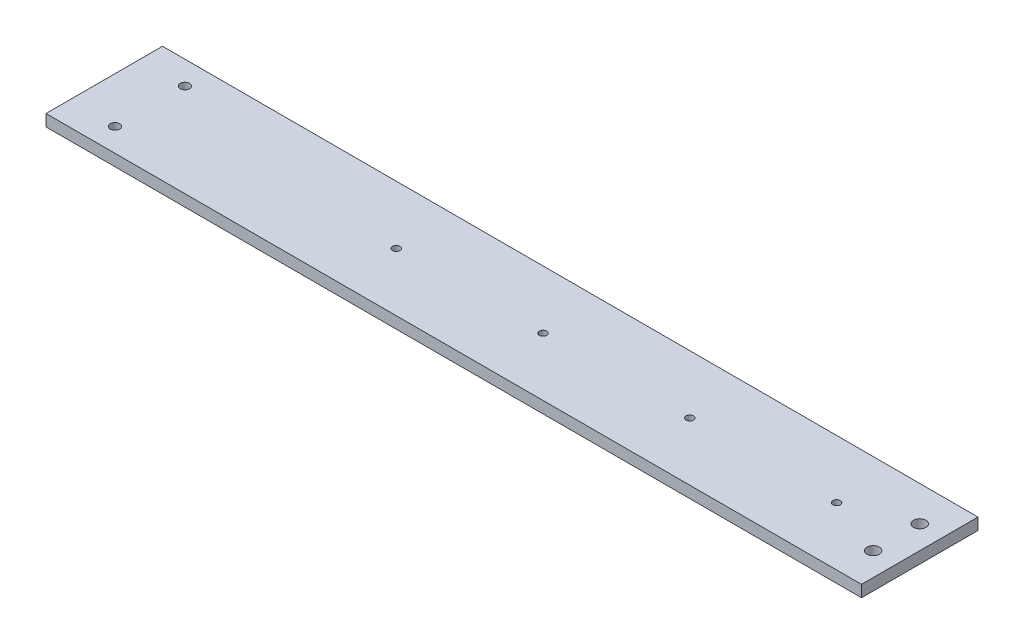
ISO-10303-21;
HEADER;
FILE_DESCRIPTION(('STEP AP214'),'2;1');
FILE_NAME('part.step','',(''),(''),'','','');
FILE_SCHEMA(('AUTOMOTIVE_DESIGN { 1 0 10303 214 1 1 1 1 }'));
ENDSEC;
DATA;
#1=APPLICATION_CONTEXT('core data for automotive mechanical design processes');
#2=APPLICATION_PROTOCOL_DEFINITION('international standard','automotive_design',2000,#1);
#3=PRODUCT_CONTEXT('',#1,'mechanical');
#4=PRODUCT('Part','Part','',(#3));
#5=PRODUCT_RELATED_PRODUCT_CATEGORY('part','',(#4));
#6=PRODUCT_DEFINITION_FORMATION('','',#4);
#7=PRODUCT_DEFINITION_CONTEXT('part definition',#1,'design');
#8=PRODUCT_DEFINITION('design','',#6,#7);
#9=PRODUCT_DEFINITION_SHAPE('','',#8);
#10=(LENGTH_UNIT() NAMED_UNIT(*) SI_UNIT(.MILLI.,.METRE.));
#11=(NAMED_UNIT(*) PLANE_ANGLE_UNIT() SI_UNIT($,.RADIAN.));
#12=(NAMED_UNIT(*) SI_UNIT($,.STERADIAN.) SOLID_ANGLE_UNIT());
#13=UNCERTAINTY_MEASURE_WITH_UNIT(LENGTH_MEASURE(1.E-05),#10,'distance_accuracy_value','');
#14=(GEOMETRIC_REPRESENTATION_CONTEXT(3) GLOBAL_UNCERTAINTY_ASSIGNED_CONTEXT((#13)) GLOBAL_UNIT_ASSIGNED_CONTEXT((#10,
#11,#12)) REPRESENTATION_CONTEXT('',''));
#15=CARTESIAN_POINT('',(0.,0.,0.));
#16=DIRECTION('',(0.,0.,1.));
#17=DIRECTION('',(1.,0.,0.));
#18=AXIS2_PLACEMENT_3D('',#15,#16,#17);
#19=CARTESIAN_POINT('',(50.8,6.35,25.4));
#20=DIRECTION('',(0.,0.,-1.));
#21=DIRECTION('',(-1.,0.,0.));
#22=AXIS2_PLACEMENT_3D('',#19,#20,#21);
#23=PLANE('',#22);
#24=DIRECTION('',(1.,0.,0.));
#25=VECTOR('',#24,1.);
#26=CARTESIAN_POINT('',(50.8,0.,25.4));
#27=LINE('',#26,#25);
#28=CARTESIAN_POINT('',(0.,0.,25.4));
#29=VERTEX_POINT('',#28);
#30=CARTESIAN_POINT('',(444.5,0.,25.4));
#31=VERTEX_POINT('',#30);
#32=EDGE_CURVE('E86',#29,#31,#27,.T.);
#33=ORIENTED_EDGE('',*,*,#32,.T.);
#34=DIRECTION('',(0.,-1.,0.));
#35=VECTOR('',#34,1.);
#36=CARTESIAN_POINT('',(444.5,6.35,25.4));
#37=LINE('',#36,#35);
#38=CARTESIAN_POINT('',(444.5,6.35,25.4));
#39=VERTEX_POINT('',#38);
#40=EDGE_CURVE('E42',#39,#31,#37,.T.);
#41=ORIENTED_EDGE('',*,*,#40,.F.);
#42=DIRECTION('',(1.,0.,0.));
#43=VECTOR('',#42,1.);
#44=CARTESIAN_POINT('',(0.,6.35,25.4));
#45=LINE('',#44,#43);
#46=CARTESIAN_POINT('',(0.,6.35,25.4));
#47=VERTEX_POINT('',#46);
#48=EDGE_CURVE('E77',#47,#39,#45,.T.);
#49=ORIENTED_EDGE('',*,*,#48,.F.);
#50=DIRECTION('',(0.,-1.,0.));
#51=VECTOR('',#50,1.);
#52=CARTESIAN_POINT('',(0.,6.35,25.4));
#53=LINE('',#52,#51);
#54=EDGE_CURVE('E11',#47,#29,#53,.T.);
#55=ORIENTED_EDGE('',*,*,#54,.T.);
#56=EDGE_LOOP('',(#33,#41,#49,#55));
#57=FACE_BOUND('',#56,.T.);
#58=ADVANCED_FACE('F34',(#57),#23,.F.);
#59=CARTESIAN_POINT('',(444.5,6.35,25.4));
#60=DIRECTION('',(-1.,0.,0.));
#61=DIRECTION('',(0.,0.,1.));
#62=AXIS2_PLACEMENT_3D('',#59,#60,#61);
#63=PLANE('',#62);
#64=DIRECTION('',(0.,0.,-1.));
#65=VECTOR('',#64,1.);
#66=CARTESIAN_POINT('',(444.5,0.,25.4));
#67=LINE('',#66,#65);
#68=CARTESIAN_POINT('',(444.5,0.,-38.1));
#69=VERTEX_POINT('',#68);
#70=EDGE_CURVE('E97',#31,#69,#67,.T.);
#71=ORIENTED_EDGE('',*,*,#70,.T.);
#72=DIRECTION('',(0.,-1.,0.));
#73=VECTOR('',#72,1.);
#74=CARTESIAN_POINT('',(444.5,6.35,-38.1));
#75=LINE('',#74,#73);
#76=CARTESIAN_POINT('',(444.5,6.35,-38.1));
#77=VERTEX_POINT('',#76);
#78=EDGE_CURVE('E88',#77,#69,#75,.T.);
#79=ORIENTED_EDGE('',*,*,#78,.F.);
#80=DIRECTION('',(0.,0.,-1.));
#81=VECTOR('',#80,1.);
#82=CARTESIAN_POINT('',(444.5,6.35,25.4));
#83=LINE('',#82,#81);
#84=EDGE_CURVE('E80',#39,#77,#83,.T.);
#85=ORIENTED_EDGE('',*,*,#84,.F.);
#86=ORIENTED_EDGE('',*,*,#40,.T.);
#87=EDGE_LOOP('',(#71,#79,#85,#86));
#88=FACE_BOUND('',#87,.T.);
#89=ADVANCED_FACE('F89',(#88),#63,.F.);
#90=CARTESIAN_POINT('',(0.,6.35,-38.1));
#91=DIRECTION('',(0.,0.,1.));
#92=DIRECTION('',(1.,0.,0.));
#93=AXIS2_PLACEMENT_3D('',#90,#91,#92);
#94=PLANE('',#93);
#95=DIRECTION('',(-1.,0.,0.));
#96=VECTOR('',#95,1.);
#97=CARTESIAN_POINT('',(0.,0.,-38.1));
#98=LINE('',#97,#96);
#99=CARTESIAN_POINT('',(0.,0.,-38.1));
#100=VERTEX_POINT('',#99);
#101=EDGE_CURVE('E67',#69,#100,#98,.T.);
#102=ORIENTED_EDGE('',*,*,#101,.T.);
#103=DIRECTION('',(0.,-1.,0.));
#104=VECTOR('',#103,1.);
#105=CARTESIAN_POINT('',(0.,6.35,-38.1));
#106=LINE('',#105,#104);
#107=CARTESIAN_POINT('',(0.,6.35,-38.1));
#108=VERTEX_POINT('',#107);
#109=EDGE_CURVE('E92',#108,#100,#106,.T.);
#110=ORIENTED_EDGE('',*,*,#109,.F.);
#111=DIRECTION('',(-1.,0.,0.));
#112=VECTOR('',#111,1.);
#113=CARTESIAN_POINT('',(50.8,6.35,-38.1));
#114=LINE('',#113,#112);
#115=EDGE_CURVE('E50',#77,#108,#114,.T.);
#116=ORIENTED_EDGE('',*,*,#115,.F.);
#117=ORIENTED_EDGE('',*,*,#78,.T.);
#118=EDGE_LOOP('',(#102,#110,#116,#117));
#119=FACE_BOUND('',#118,.T.);
#120=ADVANCED_FACE('F105',(#119),#94,.F.);
#121=CARTESIAN_POINT('',(0.,6.35,0.));
#122=DIRECTION('',(1.,0.,0.));
#123=DIRECTION('',(0.,0.,-1.));
#124=AXIS2_PLACEMENT_3D('',#121,#122,#123);
#125=PLANE('',#124);
#126=DIRECTION('',(0.,0.,1.));
#127=VECTOR('',#126,1.);
#128=CARTESIAN_POINT('',(0.,0.,0.));
#129=LINE('',#128,#127);
#130=EDGE_CURVE('E71',#100,#29,#129,.T.);
#131=ORIENTED_EDGE('',*,*,#130,.T.);
#132=ORIENTED_EDGE('',*,*,#54,.F.);
#133=DIRECTION('',(0.,0.,1.));
#134=VECTOR('',#133,1.);
#135=CARTESIAN_POINT('',(0.,6.35,0.));
#136=LINE('',#135,#134);
#137=EDGE_CURVE('E82',#108,#47,#136,.T.);
#138=ORIENTED_EDGE('',*,*,#137,.F.);
#139=ORIENTED_EDGE('',*,*,#109,.T.);
#140=EDGE_LOOP('',(#131,#132,#138,#139));
#141=FACE_BOUND('',#140,.T.);
#142=ADVANCED_FACE('F108',(#141),#125,.F.);
#143=CARTESIAN_POINT('',(0.,6.35,0.));
#144=DIRECTION('',(0.,1.,0.));
#145=DIRECTION('',(0.,0.,1.));
#146=AXIS2_PLACEMENT_3D('',#143,#144,#145);
#147=PLANE('',#146);
#148=CARTESIAN_POINT('',(24.892,6.35,12.7));
#149=DIRECTION('',(0.,1.,0.));
#150=DIRECTION('',(0.,0.,1.));
#151=AXIS2_PLACEMENT_3D('',#148,#149,#150);
#152=CIRCLE('',#151,2.5527);
#153=CARTESIAN_POINT('',(24.892,6.35,15.2527));
#154=VERTEX_POINT('',#153);
#155=EDGE_CURVE('E154',#154,#154,#152,.T.);
#156=ORIENTED_EDGE('',*,*,#155,.F.);
#157=EDGE_LOOP('',(#156));
#158=FACE_BOUND('',#157,.T.);
#159=CARTESIAN_POINT('',(24.892,6.35,-25.4));
#160=DIRECTION('',(0.,1.,0.));
#161=DIRECTION('',(0.,0.,1.));
#162=AXIS2_PLACEMENT_3D('',#159,#160,#161);
#163=CIRCLE('',#162,2.5527);
#164=CARTESIAN_POINT('',(24.892,6.35,-22.8473));
#165=VERTEX_POINT('',#164);
#166=EDGE_CURVE('E148',#165,#165,#163,.T.);
#167=ORIENTED_EDGE('',*,*,#166,.F.);
#168=EDGE_LOOP('',(#167));
#169=FACE_BOUND('',#168,.T.);
#170=CARTESIAN_POINT('',(159.18,6.35,-6.35000000001017));
#171=DIRECTION('',(0.,1.,0.));
#172=DIRECTION('',(0.,0.,1.));
#173=AXIS2_PLACEMENT_3D('',#170,#171,#172);
#174=CIRCLE('',#173,2.0193);
#175=CARTESIAN_POINT('',(159.18,6.35,-4.33070000001017));
#176=VERTEX_POINT('',#175);
#177=EDGE_CURVE('E142',#176,#176,#174,.T.);
#178=ORIENTED_EDGE('',*,*,#177,.F.);
#179=EDGE_LOOP('',(#178));
#180=FACE_BOUND('',#179,.T.);
#181=CARTESIAN_POINT('',(239.18,6.35,-6.35000000001017));
#182=DIRECTION('',(0.,1.,0.));
#183=DIRECTION('',(0.,0.,1.));
#184=AXIS2_PLACEMENT_3D('',#181,#182,#183);
#185=CIRCLE('',#184,2.0193);
#186=CARTESIAN_POINT('',(239.18,6.35,-4.33070000001017));
#187=VERTEX_POINT('',#186);
#188=EDGE_CURVE('E136',#187,#187,#185,.T.);
#189=ORIENTED_EDGE('',*,*,#188,.F.);
#190=EDGE_LOOP('',(#189));
#191=FACE_BOUND('',#190,.T.);
#192=CARTESIAN_POINT('',(399.18000004,6.35,-6.35000000001017));
#193=DIRECTION('',(0.,1.,0.));
#194=DIRECTION('',(0.,0.,1.));
#195=AXIS2_PLACEMENT_3D('',#192,#193,#194);
#196=CIRCLE('',#195,2.0193);
#197=CARTESIAN_POINT('',(399.18000004,6.35,-4.33070000001017));
#198=VERTEX_POINT('',#197);
#199=EDGE_CURVE('E130',#198,#198,#196,.T.);
#200=ORIENTED_EDGE('',*,*,#199,.F.);
#201=EDGE_LOOP('',(#200));
#202=FACE_BOUND('',#201,.T.);
#203=CARTESIAN_POINT('',(319.18,6.35,-6.35000000001017));
#204=DIRECTION('',(0.,1.,0.));
#205=DIRECTION('',(0.,0.,1.));
#206=AXIS2_PLACEMENT_3D('',#203,#204,#205);
#207=CIRCLE('',#206,2.0193);
#208=CARTESIAN_POINT('',(319.18,6.35,-4.33070000001017));
#209=VERTEX_POINT('',#208);
#210=EDGE_CURVE('E124',#209,#209,#207,.T.);
#211=ORIENTED_EDGE('',*,*,#210,.F.);
#212=EDGE_LOOP('',(#211));
#213=FACE_BOUND('',#212,.T.);
#214=CARTESIAN_POINT('',(431.8,6.35,-19.05));
#215=DIRECTION('',(0.,1.,0.));
#216=DIRECTION('',(0.,0.,1.));
#217=AXIS2_PLACEMENT_3D('',#214,#215,#216);
#218=CIRCLE('',#217,3.37343750000003);
#219=CARTESIAN_POINT('',(431.8,6.35,-15.6765625));
#220=VERTEX_POINT('',#219);
#221=EDGE_CURVE('E116',#220,#220,#218,.T.);
#222=ORIENTED_EDGE('',*,*,#221,.F.);
#223=EDGE_LOOP('',(#222));
#224=FACE_BOUND('',#223,.T.);
#225=CARTESIAN_POINT('',(431.8,6.35,6.35));
#226=DIRECTION('',(0.,1.,0.));
#227=DIRECTION('',(0.,0.,1.));
#228=AXIS2_PLACEMENT_3D('',#225,#226,#227);
#229=CIRCLE('',#228,3.37343750000003);
#230=CARTESIAN_POINT('',(431.8,6.35,9.72343750000003));
#231=VERTEX_POINT('',#230);
#232=EDGE_CURVE('E110',#231,#231,#229,.T.);
#233=ORIENTED_EDGE('',*,*,#232,.F.);
#234=EDGE_LOOP('',(#233));
#235=FACE_BOUND('',#234,.T.);
#236=ORIENTED_EDGE('',*,*,#137,.T.);
#237=ORIENTED_EDGE('',*,*,#48,.T.);
#238=ORIENTED_EDGE('',*,*,#84,.T.);
#239=ORIENTED_EDGE('',*,*,#115,.T.);
#240=EDGE_LOOP('',(#236,#237,#238,#239));
#241=FACE_BOUND('',#240,.T.);
#242=ADVANCED_FACE('F78',(#158,#169,#180,#191,#202,#213,#224,#235,#241),#147,.T.);
#243=CARTESIAN_POINT('',(0.,0.,0.));
#244=DIRECTION('',(0.,1.,0.));
#245=DIRECTION('',(0.,0.,1.));
#246=AXIS2_PLACEMENT_3D('',#243,#244,#245);
#247=PLANE('',#246);
#248=CARTESIAN_POINT('',(24.892,0.,12.7));
#249=DIRECTION('',(0.,1.,0.));
#250=DIRECTION('',(0.,0.,1.));
#251=AXIS2_PLACEMENT_3D('',#248,#249,#250);
#252=CIRCLE('',#251,2.5527);
#253=CARTESIAN_POINT('',(24.892,0.,15.2527));
#254=VERTEX_POINT('',#253);
#255=EDGE_CURVE('E151',#254,#254,#252,.T.);
#256=ORIENTED_EDGE('',*,*,#255,.T.);
#257=EDGE_LOOP('',(#256));
#258=FACE_BOUND('',#257,.T.);
#259=CARTESIAN_POINT('',(24.892,0.,-25.4));
#260=DIRECTION('',(0.,1.,0.));
#261=DIRECTION('',(0.,0.,1.));
#262=AXIS2_PLACEMENT_3D('',#259,#260,#261);
#263=CIRCLE('',#262,2.5527);
#264=CARTESIAN_POINT('',(24.892,0.,-22.8473));
#265=VERTEX_POINT('',#264);
#266=EDGE_CURVE('E145',#265,#265,#263,.T.);
#267=ORIENTED_EDGE('',*,*,#266,.T.);
#268=EDGE_LOOP('',(#267));
#269=FACE_BOUND('',#268,.T.);
#270=CARTESIAN_POINT('',(159.18,0.,-6.35000000001017));
#271=DIRECTION('',(0.,1.,0.));
#272=DIRECTION('',(0.,0.,1.));
#273=AXIS2_PLACEMENT_3D('',#270,#271,#272);
#274=CIRCLE('',#273,2.0193);
#275=CARTESIAN_POINT('',(159.18,0.,-4.33070000001017));
#276=VERTEX_POINT('',#275);
#277=EDGE_CURVE('E139',#276,#276,#274,.T.);
#278=ORIENTED_EDGE('',*,*,#277,.T.);
#279=EDGE_LOOP('',(#278));
#280=FACE_BOUND('',#279,.T.);
#281=CARTESIAN_POINT('',(239.18,0.,-6.35000000001017));
#282=DIRECTION('',(0.,1.,0.));
#283=DIRECTION('',(0.,0.,1.));
#284=AXIS2_PLACEMENT_3D('',#281,#282,#283);
#285=CIRCLE('',#284,2.0193);
#286=CARTESIAN_POINT('',(239.18,0.,-4.33070000001017));
#287=VERTEX_POINT('',#286);
#288=EDGE_CURVE('E133',#287,#287,#285,.T.);
#289=ORIENTED_EDGE('',*,*,#288,.T.);
#290=EDGE_LOOP('',(#289));
#291=FACE_BOUND('',#290,.T.);
#292=CARTESIAN_POINT('',(399.18000004,0.,-6.35000000001017));
#293=DIRECTION('',(0.,1.,0.));
#294=DIRECTION('',(0.,0.,1.));
#295=AXIS2_PLACEMENT_3D('',#292,#293,#294);
#296=CIRCLE('',#295,2.0193);
#297=CARTESIAN_POINT('',(399.18000004,0.,-4.33070000001017));
#298=VERTEX_POINT('',#297);
#299=EDGE_CURVE('E127',#298,#298,#296,.T.);
#300=ORIENTED_EDGE('',*,*,#299,.T.);
#301=EDGE_LOOP('',(#300));
#302=FACE_BOUND('',#301,.T.);
#303=CARTESIAN_POINT('',(319.18,0.,-6.35000000001017));
#304=DIRECTION('',(0.,1.,0.));
#305=DIRECTION('',(0.,0.,1.));
#306=AXIS2_PLACEMENT_3D('',#303,#304,#305);
#307=CIRCLE('',#306,2.0193);
#308=CARTESIAN_POINT('',(319.18,0.,-4.33070000001017));
#309=VERTEX_POINT('',#308);
#310=EDGE_CURVE('E119',#309,#309,#307,.T.);
#311=ORIENTED_EDGE('',*,*,#310,.T.);
#312=EDGE_LOOP('',(#311));
#313=FACE_BOUND('',#312,.T.);
#314=CARTESIAN_POINT('',(431.8,0.,-19.05));
#315=DIRECTION('',(0.,1.,0.));
#316=DIRECTION('',(0.,0.,1.));
#317=AXIS2_PLACEMENT_3D('',#314,#315,#316);
#318=CIRCLE('',#317,3.37343750000003);
#319=CARTESIAN_POINT('',(431.8,0.,-15.6765625));
#320=VERTEX_POINT('',#319);
#321=EDGE_CURVE('E113',#320,#320,#318,.T.);
#322=ORIENTED_EDGE('',*,*,#321,.T.);
#323=EDGE_LOOP('',(#322));
#324=FACE_BOUND('',#323,.T.);
#325=CARTESIAN_POINT('',(431.8,0.,6.35));
#326=DIRECTION('',(0.,1.,0.));
#327=DIRECTION('',(0.,0.,1.));
#328=AXIS2_PLACEMENT_3D('',#325,#326,#327);
#329=CIRCLE('',#328,3.37343750000003);
#330=CARTESIAN_POINT('',(431.8,0.,9.72343750000003));
#331=VERTEX_POINT('',#330);
#332=EDGE_CURVE('E98',#331,#331,#329,.T.);
#333=ORIENTED_EDGE('',*,*,#332,.T.);
#334=EDGE_LOOP('',(#333));
#335=FACE_BOUND('',#334,.T.);
#336=ORIENTED_EDGE('',*,*,#32,.F.);
#337=ORIENTED_EDGE('',*,*,#130,.F.);
#338=ORIENTED_EDGE('',*,*,#101,.F.);
#339=ORIENTED_EDGE('',*,*,#70,.F.);
#340=EDGE_LOOP('',(#336,#337,#338,#339));
#341=FACE_BOUND('',#340,.T.);
#342=ADVANCED_FACE('F162',(#258,#269,#280,#291,#302,#313,#324,#335,#341),#247,.F.);
#343=CARTESIAN_POINT('',(431.8,0.,6.35));
#344=DIRECTION('',(0.,1.,0.));
#345=DIRECTION('',(0.,0.,1.));
#346=AXIS2_PLACEMENT_3D('',#343,#344,#345);
#347=CYLINDRICAL_SURFACE('',#346,3.37343750000003);
#348=ORIENTED_EDGE('',*,*,#332,.F.);
#349=EDGE_LOOP('',(#348));
#350=FACE_BOUND('',#349,.T.);
#351=ORIENTED_EDGE('',*,*,#232,.T.);
#352=EDGE_LOOP('',(#351));
#353=FACE_BOUND('',#352,.T.);
#354=ADVANCED_FACE('F178',(#350,#353),#347,.F.);
#355=CARTESIAN_POINT('',(431.8,0.,-19.05));
#356=DIRECTION('',(0.,1.,0.));
#357=DIRECTION('',(0.,0.,1.));
#358=AXIS2_PLACEMENT_3D('',#355,#356,#357);
#359=CYLINDRICAL_SURFACE('',#358,3.37343750000003);
#360=ORIENTED_EDGE('',*,*,#321,.F.);
#361=EDGE_LOOP('',(#360));
#362=FACE_BOUND('',#361,.T.);
#363=ORIENTED_EDGE('',*,*,#221,.T.);
#364=EDGE_LOOP('',(#363));
#365=FACE_BOUND('',#364,.T.);
#366=ADVANCED_FACE('F180',(#362,#365),#359,.F.);
#367=CARTESIAN_POINT('',(319.18,6.35,-6.35000000001017));
#368=DIRECTION('',(0.,1.,0.));
#369=DIRECTION('',(0.,0.,1.));
#370=AXIS2_PLACEMENT_3D('',#367,#368,#369);
#371=CYLINDRICAL_SURFACE('',#370,2.0193);
#372=ORIENTED_EDGE('',*,*,#310,.F.);
#373=EDGE_LOOP('',(#372));
#374=FACE_BOUND('',#373,.T.);
#375=ORIENTED_EDGE('',*,*,#210,.T.);
#376=EDGE_LOOP('',(#375));
#377=FACE_BOUND('',#376,.T.);
#378=ADVANCED_FACE('F187',(#374,#377),#371,.F.);
#379=CARTESIAN_POINT('',(399.18000004,6.35,-6.35000000001017));
#380=DIRECTION('',(0.,1.,0.));
#381=DIRECTION('',(0.,0.,1.));
#382=AXIS2_PLACEMENT_3D('',#379,#380,#381);
#383=CYLINDRICAL_SURFACE('',#382,2.0193);
#384=ORIENTED_EDGE('',*,*,#299,.F.);
#385=EDGE_LOOP('',(#384));
#386=FACE_BOUND('',#385,.T.);
#387=ORIENTED_EDGE('',*,*,#199,.T.);
#388=EDGE_LOOP('',(#387));
#389=FACE_BOUND('',#388,.T.);
#390=ADVANCED_FACE('F246',(#386,#389),#383,.F.);
#391=CARTESIAN_POINT('',(239.18,6.35,-6.35000000001017));
#392=DIRECTION('',(0.,1.,0.));
#393=DIRECTION('',(0.,0.,1.));
#394=AXIS2_PLACEMENT_3D('',#391,#392,#393);
#395=CYLINDRICAL_SURFACE('',#394,2.0193);
#396=ORIENTED_EDGE('',*,*,#288,.F.);
#397=EDGE_LOOP('',(#396));
#398=FACE_BOUND('',#397,.T.);
#399=ORIENTED_EDGE('',*,*,#188,.T.);
#400=EDGE_LOOP('',(#399));
#401=FACE_BOUND('',#400,.T.);
#402=ADVANCED_FACE('F251',(#398,#401),#395,.F.);
#403=CARTESIAN_POINT('',(159.18,6.35,-6.35000000001017));
#404=DIRECTION('',(0.,1.,0.));
#405=DIRECTION('',(0.,0.,1.));
#406=AXIS2_PLACEMENT_3D('',#403,#404,#405);
#407=CYLINDRICAL_SURFACE('',#406,2.0193);
#408=ORIENTED_EDGE('',*,*,#277,.F.);
#409=EDGE_LOOP('',(#408));
#410=FACE_BOUND('',#409,.T.);
#411=ORIENTED_EDGE('',*,*,#177,.T.);
#412=EDGE_LOOP('',(#411));
#413=FACE_BOUND('',#412,.T.);
#414=ADVANCED_FACE('F228',(#410,#413),#407,.F.);
#415=CARTESIAN_POINT('',(24.892,6.35,-25.4));
#416=DIRECTION('',(0.,1.,0.));
#417=DIRECTION('',(0.,0.,1.));
#418=AXIS2_PLACEMENT_3D('',#415,#416,#417);
#419=CYLINDRICAL_SURFACE('',#418,2.5527);
#420=ORIENTED_EDGE('',*,*,#266,.F.);
#421=EDGE_LOOP('',(#420));
#422=FACE_BOUND('',#421,.T.);
#423=ORIENTED_EDGE('',*,*,#166,.T.);
#424=EDGE_LOOP('',(#423));
#425=FACE_BOUND('',#424,.T.);
#426=ADVANCED_FACE('F222',(#422,#425),#419,.F.);
#427=CARTESIAN_POINT('',(24.892,6.35,12.7));
#428=DIRECTION('',(0.,1.,0.));
#429=DIRECTION('',(0.,0.,1.));
#430=AXIS2_PLACEMENT_3D('',#427,#428,#429);
#431=CYLINDRICAL_SURFACE('',#430,2.5527);
#432=ORIENTED_EDGE('',*,*,#255,.F.);
#433=EDGE_LOOP('',(#432));
#434=FACE_BOUND('',#433,.T.);
#435=ORIENTED_EDGE('',*,*,#155,.T.);
#436=EDGE_LOOP('',(#435));
#437=FACE_BOUND('',#436,.T.);
#438=ADVANCED_FACE('F158',(#434,#437),#431,.F.);
#439=CLOSED_SHELL('',(#58,#89,#120,#142,#242,#342,#354,#366,#378,#390,#402,#414,#426,#438));
#440=MANIFOLD_SOLID_BREP('B2',#439);
#441=ADVANCED_BREP_SHAPE_REPRESENTATION('',(#18,#440),#14);
#442=SHAPE_DEFINITION_REPRESENTATION(#9,#441);
ENDSEC;
END-ISO-10303-21;
